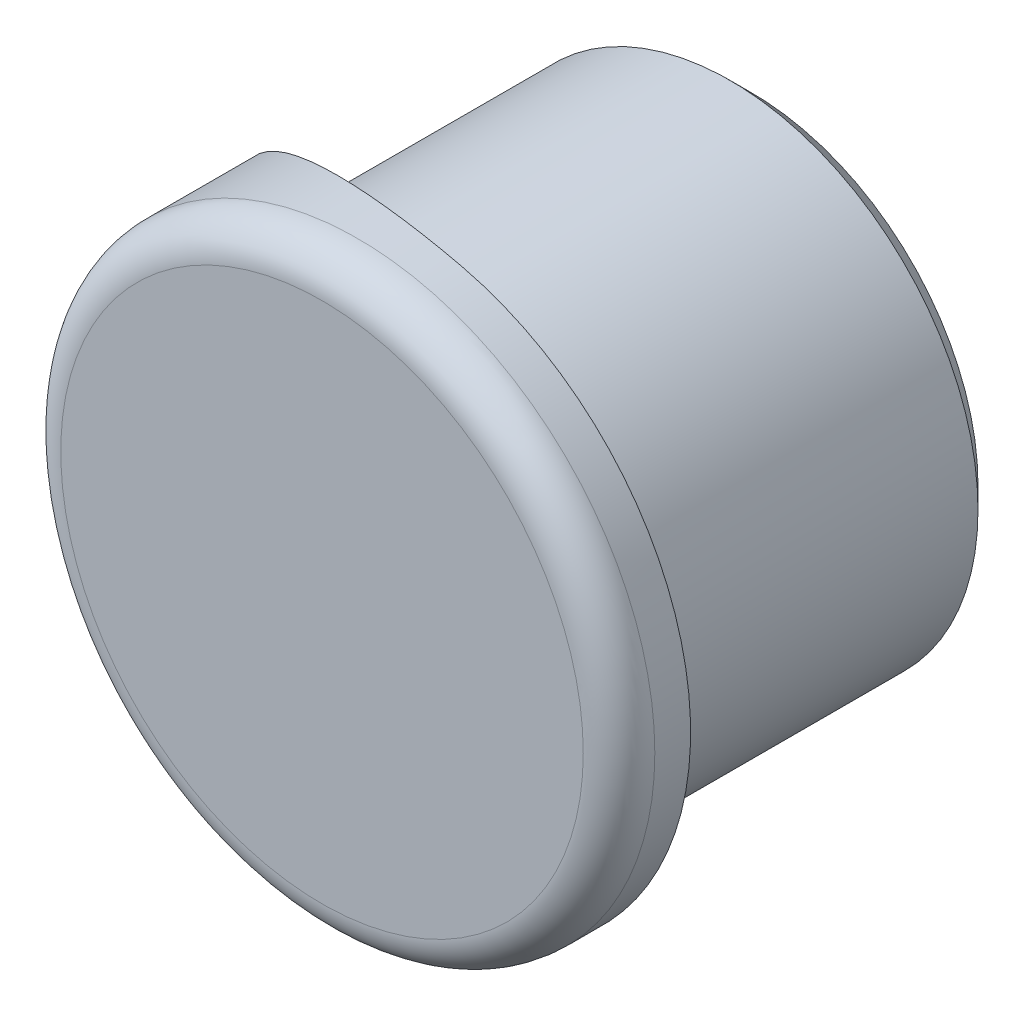
ISO-10303-21;
HEADER;
FILE_DESCRIPTION(('STEP AP214'),'2;1');
FILE_NAME('part.step','',(''),(''),'','','');
FILE_SCHEMA(('AUTOMOTIVE_DESIGN { 1 0 10303 214 1 1 1 1 }'));
ENDSEC;
DATA;
#1=APPLICATION_CONTEXT('core data for automotive mechanical design processes');
#2=APPLICATION_PROTOCOL_DEFINITION('international standard','automotive_design',2000,#1);
#3=PRODUCT_CONTEXT('',#1,'mechanical');
#4=PRODUCT('Part','Part','',(#3));
#5=PRODUCT_RELATED_PRODUCT_CATEGORY('part','',(#4));
#6=PRODUCT_DEFINITION_FORMATION('','',#4);
#7=PRODUCT_DEFINITION_CONTEXT('part definition',#1,'design');
#8=PRODUCT_DEFINITION('design','',#6,#7);
#9=PRODUCT_DEFINITION_SHAPE('','',#8);
#10=(LENGTH_UNIT() NAMED_UNIT(*) SI_UNIT(.MILLI.,.METRE.));
#11=(NAMED_UNIT(*) PLANE_ANGLE_UNIT() SI_UNIT($,.RADIAN.));
#12=(NAMED_UNIT(*) SI_UNIT($,.STERADIAN.) SOLID_ANGLE_UNIT());
#13=UNCERTAINTY_MEASURE_WITH_UNIT(LENGTH_MEASURE(1.E-05),#10,'distance_accuracy_value','');
#14=(GEOMETRIC_REPRESENTATION_CONTEXT(3) GLOBAL_UNCERTAINTY_ASSIGNED_CONTEXT((#13)) GLOBAL_UNIT_ASSIGNED_CONTEXT((#10,
#11,#12)) REPRESENTATION_CONTEXT('',''));
#15=CARTESIAN_POINT('',(0.,0.,0.));
#16=DIRECTION('',(0.,0.,1.));
#17=DIRECTION('',(1.,0.,0.));
#18=AXIS2_PLACEMENT_3D('',#15,#16,#17);
#19=CARTESIAN_POINT('',(-38.,67.,-5.));
#20=DIRECTION('',(0.,0.,1.));
#21=DIRECTION('',(1.,0.,0.));
#22=AXIS2_PLACEMENT_3D('',#19,#20,#21);
#23=CYLINDRICAL_SURFACE('',#22,3.46500000000001);
#24=DIRECTION('',(0.,0.,-1.));
#25=VECTOR('',#24,1.);
#26=CARTESIAN_POINT('',(-39.292284798332,63.785,1.001));
#27=LINE('',#26,#25);
#28=CARTESIAN_POINT('',(-39.292284798332,63.785,-0.325062518872272));
#29=VERTEX_POINT('',#28);
#30=CARTESIAN_POINT('',(-39.292284798332,63.785,-4.69999999999999));
#31=VERTEX_POINT('',#30);
#32=EDGE_CURVE('E63',#29,#31,#27,.T.);
#33=ORIENTED_EDGE('',*,*,#32,.F.);
#34=CARTESIAN_POINT('',(-34.535,67.,-0.400657923214667));
#35=CARTESIAN_POINT('',(-34.5350011192577,67.0948957281984,-0.400656985389254));
#36=CARTESIAN_POINT('',(-34.5389055021327,67.1898219317335,-0.399368852872305));
#37=CARTESIAN_POINT('',(-34.5544772525292,67.3789822970893,-0.394274555914238));
#38=CARTESIAN_POINT('',(-34.5661491313663,67.4732160245484,-0.390466928172532));
#39=CARTESIAN_POINT('',(-34.6127558877772,67.7541885332388,-0.375441268165278));
#40=CARTESIAN_POINT('',(-34.6592816111299,67.9389586494806,-0.360620993873424));
#41=CARTESIAN_POINT('',(-34.7813833588734,68.2971146514612,-0.323725001024826));
#42=CARTESIAN_POINT('',(-34.8568782801617,68.470530751622,-0.301669563058351));
#43=CARTESIAN_POINT('',(-35.0346734192286,68.8023516732511,-0.253571784396536));
#44=CARTESIAN_POINT('',(-35.1369668349063,68.9607602901056,-0.227530456112169));
#45=CARTESIAN_POINT('',(-35.3695894581378,69.2638124229693,-0.174332423293026));
#46=CARTESIAN_POINT('',(-35.5007291471459,69.4078329346568,-0.147167177437789));
#47=CARTESIAN_POINT('',(-35.7857093632476,69.6722495530427,-0.0968249070936301));
#48=CARTESIAN_POINT('',(-35.9395523068001,69.792643141788,-0.0736483077125131));
#49=CARTESIAN_POINT('',(-36.2666303311044,70.0066542459041,-0.0352792019264993));
#50=CARTESIAN_POINT('',(-36.4399334825967,70.1001734247758,-0.0201158513601304));
#51=CARTESIAN_POINT('',(-36.8003942582355,70.2566425288117,-0.00140975183757399));
#52=CARTESIAN_POINT('',(-36.9875447090844,70.3196081555732,0.00213897132229998));
#53=CARTESIAN_POINT('',(-37.3585226743484,70.4101417603151,-0.0045170584851117));
#54=CARTESIAN_POINT('',(-37.5419178704721,70.4395440495656,-0.0139393400777888));
#55=CARTESIAN_POINT('',(-37.9098962281323,70.4687402686873,-0.0458414078334991));
#56=CARTESIAN_POINT('',(-38.094479209676,70.4685385836859,-0.068319259631799));
#57=CARTESIAN_POINT('',(-38.4541801556865,70.4397099509942,-0.124838159056097));
#58=CARTESIAN_POINT('',(-38.6294183252234,70.411882328781,-0.158536344344614));
#59=CARTESIAN_POINT('',(-38.9715232413143,70.3306606715974,-0.235937337453948));
#60=CARTESIAN_POINT('',(-39.1383881713702,70.2772611152933,-0.279642304813141));
#61=CARTESIAN_POINT('',(-39.4696837733798,70.1432500413001,-0.377411480404669));
#62=CARTESIAN_POINT('',(-39.6334122717408,70.0612402007051,-0.431929416844581));
#63=CARTESIAN_POINT('',(-39.9447447011074,69.8735464599806,-0.546079809336016));
#64=CARTESIAN_POINT('',(-40.092340152915,69.7678501989191,-0.605714925761603));
#65=CARTESIAN_POINT('',(-40.382724685148,69.5235598642113,-0.732246807786706));
#66=CARTESIAN_POINT('',(-40.5235882937771,69.3827437618093,-0.799277584037218));
#67=CARTESIAN_POINT('',(-40.7800987392563,69.0777274904943,-0.929290394936549));
#68=CARTESIAN_POINT('',(-40.8957282896773,68.9135114180864,-0.992269633406572));
#69=CARTESIAN_POINT('',(-41.0484614992409,68.6503627988322,-1.07932975913158));
#70=CARTESIAN_POINT('',(-41.0962979423923,68.5588207582527,-1.10736117138529));
#71=CARTESIAN_POINT('',(-41.1839240673632,68.3709764230694,-1.159749309023));
#72=CARTESIAN_POINT('',(-41.2237181048052,68.2746767404787,-1.18410802165));
#73=CARTESIAN_POINT('',(-41.294675136332,68.0780768734887,-1.22822655587355));
#74=CARTESIAN_POINT('',(-41.3258496853295,67.9777822530421,-1.24799252856462));
#75=CARTESIAN_POINT('',(-41.3791081012437,67.7739143771681,-1.28213352888147));
#76=CARTESIAN_POINT('',(-41.4011940970647,67.6703418956758,-1.29650981891721));
#77=CARTESIAN_POINT('',(-41.4334461318672,67.4754358475762,-1.31763605886592));
#78=CARTESIAN_POINT('',(-41.4448372613958,67.3843878309291,-1.32516512785783));
#79=CARTESIAN_POINT('',(-41.4603592015494,67.2014123130447,-1.33544570046317));
#80=CARTESIAN_POINT('',(-41.4644909869457,67.109484931554,-1.33819784551255));
#81=CARTESIAN_POINT('',(-41.4654201832672,66.9256031903779,-1.33881547526933));
#82=CARTESIAN_POINT('',(-41.4622200474372,66.8336488500067,-1.33668259449584));
#83=CARTESIAN_POINT('',(-41.4485574571683,66.65054665138,-1.32762645527127));
#84=CARTESIAN_POINT('',(-41.4380952964178,66.5593987606612,-1.3207033905433));
#85=CARTESIAN_POINT('',(-41.3991567922284,66.3084016400528,-1.29514526789084));
#86=CARTESIAN_POINT('',(-41.3630005351098,66.150167119285,-1.27159007893166));
#87=CARTESIAN_POINT('',(-41.2698850415623,65.8424143958316,-1.2126047075434));
#88=CARTESIAN_POINT('',(-41.2129195982387,65.6928988092471,-1.17717098228377));
#89=CARTESIAN_POINT('',(-41.0747103407353,65.3932075143471,-1.09436969996753));
#90=CARTESIAN_POINT('',(-40.9918608605046,65.2439796294623,-1.04626269629798));
#91=CARTESIAN_POINT('',(-40.8064224035896,64.9606532947735,-0.943967934044831));
#92=CARTESIAN_POINT('',(-40.7038219304809,64.826563728973,-0.889776641684433));
#93=CARTESIAN_POINT('',(-40.4634534285218,64.5555530744633,-0.77045182146391));
#94=CARTESIAN_POINT('',(-40.3226971434884,64.4214412832022,-0.704928243285893));
#95=CARTESIAN_POINT('',(-40.0201322502592,64.1781205054357,-0.575981722355459));
#96=CARTESIAN_POINT('',(-39.8583127691189,64.0689244612874,-0.512559885895578));
#97=CARTESIAN_POINT('',(-39.5075948292173,63.8733805738751,-0.389312821231469));
#98=CARTESIAN_POINT('',(-39.3177191923377,63.7885385095194,-0.329852799274537));
#99=CARTESIAN_POINT('',(-38.9227606879262,63.6536302915031,-0.223234961128988));
#100=CARTESIAN_POINT('',(-38.7176891958916,63.6035384094773,-0.176068059539049));
#101=CARTESIAN_POINT('',(-38.3159220961729,63.5439552757278,-0.100786488654761));
#102=CARTESIAN_POINT('',(-38.1199008637462,63.5314944461973,-0.0714346881586112));
#103=CARTESIAN_POINT('',(-37.7269724878194,63.5401975142087,-0.027536377717417));
#104=CARTESIAN_POINT('',(-37.5300658651042,63.5613437113143,-0.0129820807159925));
#105=CARTESIAN_POINT('',(-37.1583336236302,63.6338886683361,0.00103459603555801));
#106=CARTESIAN_POINT('',(-36.983027340551,63.6826450020609,0.00164400037690785));
#107=CARTESIAN_POINT('',(-36.6424697354413,63.8068530308265,-0.00781965603974612));
#108=CARTESIAN_POINT('',(-36.477218858977,63.8823059078124,-0.0178931898065255));
#109=CARTESIAN_POINT('',(-36.1598769632398,64.0583395311885,-0.0463988664987246));
#110=CARTESIAN_POINT('',(-36.0078962089916,64.1591079696991,-0.064894322054996));
#111=CARTESIAN_POINT('',(-35.7220175286328,64.382754681577,-0.107155832494376));
#112=CARTESIAN_POINT('',(-35.5881237451018,64.5056380050839,-0.130923091531641));
#113=CARTESIAN_POINT('',(-35.3339116935948,64.7785062773143,-0.181808882945439));
#114=CARTESIAN_POINT('',(-35.2148852828911,64.9296729836955,-0.209042849933061));
#115=CARTESIAN_POINT('',(-35.0032114322688,65.2500528969504,-0.261538577492637));
#116=CARTESIAN_POINT('',(-34.9105817823354,65.4192781692397,-0.286798999719347));
#117=CARTESIAN_POINT('',(-34.7926199931933,65.6852096901427,-0.320583376809268));
#118=CARTESIAN_POINT('',(-34.7565066355997,65.7770021463424,-0.331258845429686));
#119=CARTESIAN_POINT('',(-34.6921888233801,65.9635048078427,-0.350662151748602));
#120=CARTESIAN_POINT('',(-34.6639810801291,66.0582137816615,-0.359390798988086));
#121=CARTESIAN_POINT('',(-34.6157823568693,66.2496513067681,-0.374514950191058));
#122=CARTESIAN_POINT('',(-34.5957734288891,66.3463749543007,-0.380915546983146));
#123=CARTESIAN_POINT('',(-34.5640831796046,66.5412679108087,-0.391133445935712));
#124=CARTESIAN_POINT('',(-34.5523964880248,66.6394362457133,-0.394952413920624));
#125=CARTESIAN_POINT('',(-34.5416182925394,66.7815181372765,-0.398483270080353));
#126=CARTESIAN_POINT('',(-34.5391372354021,66.8251715777705,-0.399297907541584));
#127=CARTESIAN_POINT('',(-34.5358278257751,66.9125478547272,-0.400385451984138));
#128=CARTESIAN_POINT('',(-34.5349994842301,66.9562706916475,-0.400658355378025));
#129=CARTESIAN_POINT('',(-34.535,67.,-0.400657923214667));
#130=B_SPLINE_CURVE_WITH_KNOTS('',3,(#34,#35,#36,#37,#38,#39,#40,#41,#42,#43,#44,#45,#46,#47,
#48,#49,#50,#51,#52,#53,#54,#55,#56,#57,#58,#59,#60,#61,#62,#63,#64,#65,#66,#67,#68,#69,#70,#71,
#72,#73,#74,#75,#76,#77,#78,#79,#80,#81,#82,#83,#84,#85,#86,#87,#88,#89,#90,#91,#92,#93,#94,#95,
#96,#97,#98,#99,#100,#101,#102,#103,#104,#105,#106,#107,#108,#109,#110,#111,#112,#113,#114,#115,
#116,#117,#118,#119,#120,#121,#122,#123,#124,#125,#126,#127,#128,#129),.UNSPECIFIED.,.T.,.F.,(4,
2,2,2,2,2,2,2,2,2,2,2,2,2,2,2,2,2,2,2,2,2,2,2,2,2,2,2,2,2,2,2,2,2,2,2,2,2,2,2,2,2,2,2,2,2,2,4),
(0.,0.284640611948893,0.569446685927191,1.13976936155237,1.70850685739108,2.27710013363597,
2.86436883992426,3.45170009828666,4.04115387217319,4.63030440165197,5.18542957441174,
5.74047251861201,6.27991062964134,6.81946526535747,7.39030547681752,7.9614442820149,
8.58917713224544,9.21733866627191,9.53802211699978,9.85853142314634,10.1786089618996,
10.4986114828974,10.7744128568663,11.0501771939033,11.3258492742678,11.6015102066413,
12.0912349943867,12.5811059750482,13.1110767275559,13.6413568970471,14.2541948851555,
14.8673504877714,15.5127910043381,16.1577531377056,16.7502830614329,17.342501009842,
17.8858142321222,18.4291515117029,18.9766425929876,19.5242588579601,20.1046453707213,
20.6854221124281,20.9827604175396,21.2799748498674,21.5765351306743,21.8729038695673,
22.0040694646897,22.1352359284058),.UNSPECIFIED.);
#131=CARTESIAN_POINT('',(-37.035,70.3279122584588,0.));
#132=VERTEX_POINT('',#131);
#133=EDGE_CURVE('E102',#132,#29,#130,.T.);
#134=ORIENTED_EDGE('',*,*,#133,.F.);
#135=CARTESIAN_POINT('',(-38.,67.,0.));
#136=DIRECTION('',(0.,0.,1.));
#137=DIRECTION('',(1.,0.,0.));
#138=AXIS2_PLACEMENT_3D('',#135,#136,#137);
#139=CIRCLE('',#138,3.46500000000001);
#140=CARTESIAN_POINT('',(-37.035,63.6720877415413,0.));
#141=VERTEX_POINT('',#140);
#142=EDGE_CURVE('E106',#141,#132,#139,.T.);
#143=ORIENTED_EDGE('',*,*,#142,.F.);
#144=CARTESIAN_POINT('',(-39.292284798332,63.785,-0.32506251887227));
#145=CARTESIAN_POINT('',(-39.2088110317047,63.7514391783668,-0.30050079710655));
#146=CARTESIAN_POINT('',(-39.1237478930821,63.7210322117049,-0.276973220778825));
#147=CARTESIAN_POINT('',(-38.9509018796859,63.6668026124838,-0.232294706070464));
#148=CARTESIAN_POINT('',(-38.8631178814633,63.6429827411372,-0.211144766557959));
#149=CARTESIAN_POINT('',(-38.6852133700739,63.6021989514927,-0.171518336201442));
#150=CARTESIAN_POINT('',(-38.5950892443047,63.5852463979842,-0.153046309230043));
#151=CARTESIAN_POINT('',(-38.4132452753811,63.5585037890876,-0.11907429613798));
#152=CARTESIAN_POINT('',(-38.3215257137865,63.5487124827642,-0.103573791297468));
#153=CARTESIAN_POINT('',(-38.1368344898777,63.5364624289042,-0.0756886904899066));
#154=CARTESIAN_POINT('',(-38.0438598445084,63.5340263227621,-0.0633138230279588));
#155=CARTESIAN_POINT('',(-37.8576386239975,63.5366737523988,-0.0418564087764505));
#156=CARTESIAN_POINT('',(-37.7643920582034,63.5417570326622,-0.0327737501277287));
#157=CARTESIAN_POINT('',(-37.5785571445745,63.5594616029903,-0.0179441217451942));
#158=CARTESIAN_POINT('',(-37.485967806473,63.5720664811043,-0.0121899430232769));
#159=CARTESIAN_POINT('',(-37.302009036846,63.6047451241238,-0.00392726040343618));
#160=CARTESIAN_POINT('',(-37.2106390583764,63.6248154152018,-0.00141724934708018));
#161=CARTESIAN_POINT('',(-37.0500879109878,63.6669606606188,0.000293278203638717));
#162=CARTESIAN_POINT('',(-36.980525475394,63.6875769168664,0.000109696748403054));
#163=CARTESIAN_POINT('',(-36.842923192907,63.7330975636126,-0.00200942063283656));
#164=CARTESIAN_POINT('',(-36.7748818739291,63.7579975856741,-0.00394318026405082));
#165=CARTESIAN_POINT('',(-36.707715201668,63.785,-0.00669751224308465));
#166=B_SPLINE_CURVE_WITH_KNOTS('',3,(#144,#145,#146,#147,#148,#149,#150,#151,#152,#153,#154,
#155,#156,#157,#158,#159,#160,#161,#162,#163,#164,#165),.UNSPECIFIED.,.F.,.F.,(4,2,2,2,2,2,2,2,
2,2,4),(0.,0.279731771267792,0.559580624812562,0.839890729254229,1.12015185708577,
1.40127483312486,1.68238825657162,1.96289052855738,2.24326243937007,2.46076460981109,
2.67804627969648),.UNSPECIFIED.);
#167=CARTESIAN_POINT('',(-36.707715201668,63.785,-0.00669751224309338));
#168=VERTEX_POINT('',#167);
#169=EDGE_CURVE('E95',#141,#168,#166,.T.);
#170=ORIENTED_EDGE('',*,*,#169,.T.);
#171=DIRECTION('',(0.,0.,-1.));
#172=VECTOR('',#171,1.);
#173=CARTESIAN_POINT('',(-36.707715201668,63.785,1.001));
#174=LINE('',#173,#172);
#175=CARTESIAN_POINT('',(-36.707715201668,63.785,-4.69999999999999));
#176=VERTEX_POINT('',#175);
#177=EDGE_CURVE('E87',#168,#176,#174,.T.);
#178=ORIENTED_EDGE('',*,*,#177,.T.);
#179=CARTESIAN_POINT('',(-38.,67.,-4.69999999999999));
#180=DIRECTION('',(0.,0.,1.));
#181=DIRECTION('',(1.,0.,0.));
#182=AXIS2_PLACEMENT_3D('',#179,#180,#181);
#183=CIRCLE('',#182,3.46500000000001);
#184=EDGE_CURVE('E151',#176,#31,#183,.T.);
#185=ORIENTED_EDGE('',*,*,#184,.T.);
#186=EDGE_LOOP('',(#33,#134,#143,#170,#178,#185));
#187=FACE_BOUND('',#186,.T.);
#188=ADVANCED_FACE('F42',(#187),#23,.T.);
#189=CARTESIAN_POINT('',(-38.,67.,-5.));
#190=DIRECTION('',(0.,0.,1.));
#191=DIRECTION('',(1.,0.,0.));
#192=AXIS2_PLACEMENT_3D('',#189,#190,#191);
#193=PLANE('',#192);
#194=CARTESIAN_POINT('',(-38.,67.,-5.));
#195=DIRECTION('',(0.,0.,1.));
#196=DIRECTION('',(1.,0.,0.));
#197=AXIS2_PLACEMENT_3D('',#194,#195,#196);
#198=CIRCLE('',#197,3.165);
#199=CARTESIAN_POINT('',(-34.835,67.,-5.));
#200=VERTEX_POINT('',#199);
#201=EDGE_CURVE('E57',#200,#200,#198,.F.);
#202=ORIENTED_EDGE('',*,*,#201,.T.);
#203=EDGE_LOOP('',(#202));
#204=FACE_BOUND('',#203,.T.);
#205=ADVANCED_FACE('F155',(#204),#193,.F.);
#206=CARTESIAN_POINT('',(-38.,67.,1.));
#207=DIRECTION('',(0.,0.,-1.));
#208=DIRECTION('',(-1.,0.,0.));
#209=AXIS2_PLACEMENT_3D('',#206,#207,#208);
#210=CYLINDRICAL_SURFACE('',#209,4.15);
#211=CARTESIAN_POINT('',(-37.035,71.0362451610377,0.));
#212=CARTESIAN_POINT('',(-37.1389135149355,71.0611079817524,1.89169779381795E-05));
#213=CARTESIAN_POINT('',(-37.2437955322097,71.081922915731,-0.00202389874618023));
#214=CARTESIAN_POINT('',(-37.4546683406772,71.1153939456416,-0.010323578353209));
#215=CARTESIAN_POINT('',(-37.5606589188467,71.1280515808569,-0.0165796467388777));
#216=CARTESIAN_POINT('',(-37.7725222945634,71.1451190816508,-0.0333616310134262));
#217=CARTESIAN_POINT('',(-37.8783937723876,71.1495627761947,-0.0438698154999375));
#218=CARTESIAN_POINT('',(-38.089658042955,71.1503757364488,-0.0691103473404647));
#219=CARTESIAN_POINT('',(-38.1950508378342,71.1467450382211,-0.0838426758281747));
#220=CARTESIAN_POINT('',(-38.4045601836983,71.1315679921022,-0.117389394789987));
#221=CARTESIAN_POINT('',(-38.5086773060836,71.1200253307163,-0.136201881363199));
#222=CARTESIAN_POINT('',(-38.7150075392414,71.0892739945365,-0.177680947209888));
#223=CARTESIAN_POINT('',(-38.8172199108204,71.0700624058739,-0.200348989550854));
#224=CARTESIAN_POINT('',(-39.1200758691205,71.0013389960265,-0.273715798384254));
#225=CARTESIAN_POINT('',(-39.3170192516607,70.9407323337533,-0.329790460113771));
#226=CARTESIAN_POINT('',(-39.7051398167684,70.7895099322629,-0.455867304034078));
#227=CARTESIAN_POINT('',(-39.8956665510677,70.6976747389526,-0.526379694514081));
#228=CARTESIAN_POINT('',(-40.2584168970998,70.4879769884797,-0.675514728598037));
#229=CARTESIAN_POINT('',(-40.430626987067,70.37009539813,-0.754143280514679));
#230=CARTESIAN_POINT('',(-40.7763646952639,70.0934969622362,-0.925803074440837));
#231=CARTESIAN_POINT('',(-40.9469519052243,69.9314198179557,-1.01934872426885));
#232=CARTESIAN_POINT('',(-41.2591187576431,69.579903700734,-1.20370117175869));
#233=CARTESIAN_POINT('',(-41.4006933858657,69.3904600076701,-1.29450749367446));
#234=CARTESIAN_POINT('',(-41.6349101216026,69.0130912477936,-1.45338544851009));
#235=CARTESIAN_POINT('',(-41.7315400700653,68.8282480086606,-1.52287631277185));
#236=CARTESIAN_POINT('',(-41.8971533464349,68.4417729767873,-1.64624764454559));
#237=CARTESIAN_POINT('',(-41.9661818795391,68.2401692937627,-1.70015359635628));
#238=CARTESIAN_POINT('',(-42.064693076734,67.8565339639283,-1.77862164178542));
#239=CARTESIAN_POINT('',(-42.0986557972807,67.6763332182839,-1.80644310750016));
#240=CARTESIAN_POINT('',(-42.1423965210148,67.3111164231759,-1.84245594291728));
#241=CARTESIAN_POINT('',(-42.1521934199031,67.1261042503263,-1.85066264960499));
#242=CARTESIAN_POINT('',(-42.1469771588566,66.7565597474659,-1.8463267732705));
#243=CARTESIAN_POINT('',(-42.1319462428684,66.572027855481,-1.83376934039776));
#244=CARTESIAN_POINT('',(-42.0780251727898,66.2088046245632,-1.78960027745198));
#245=CARTESIAN_POINT('',(-42.0391165958171,66.0301179077298,-1.75797393503358));
#246=CARTESIAN_POINT('',(-41.9389745922965,65.6807631636107,-1.67899584016737));
#247=CARTESIAN_POINT('',(-41.8775086433209,65.5102003494238,-1.63148077629907));
#248=CARTESIAN_POINT('',(-41.734633723052,65.1814331915484,-1.52532962372409));
#249=CARTESIAN_POINT('',(-41.6532178052639,65.0232331778952,-1.46668966298444));
#250=CARTESIAN_POINT('',(-41.4540060687908,64.6897346547747,-1.32993726480183));
#251=CARTESIAN_POINT('',(-41.3321811201858,64.5174714539867,-1.25028721984197));
#252=CARTESIAN_POINT('',(-41.0649358255179,64.1941549796061,-1.087387809847));
#253=CARTESIAN_POINT('',(-40.9194903436855,64.0431246239115,-1.00413468059121));
#254=CARTESIAN_POINT('',(-40.579381173062,63.7396640988152,-0.825023159385072));
#255=CARTESIAN_POINT('',(-40.3805582161435,63.5916034101299,-0.729504987108265));
#256=CARTESIAN_POINT('',(-40.0625965436332,63.3967106548949,-0.594121255174185));
#257=CARTESIAN_POINT('',(-39.9532573852021,63.3362542878907,-0.550287504788075));
#258=CARTESIAN_POINT('',(-39.7285038670213,63.2250204110157,-0.466116942361644));
#259=CARTESIAN_POINT('',(-39.6130929292975,63.1742375222387,-0.425778193780065));
#260=CARTESIAN_POINT('',(-39.3801271859431,63.0842739032036,-0.350493124651787));
#261=CARTESIAN_POINT('',(-39.2627191585208,63.0448119562349,-0.315428816153777));
#262=CARTESIAN_POINT('',(-39.0236573359609,62.9763107710146,-0.250123695618747));
#263=CARTESIAN_POINT('',(-38.902005918258,62.9472657962053,-0.219880233887203));
#264=CARTESIAN_POINT('',(-38.6555274650118,62.9001830814429,-0.164835236264505));
#265=CARTESIAN_POINT('',(-38.5307044580355,62.8821320401754,-0.140027147608859));
#266=CARTESIAN_POINT('',(-38.2789849889568,62.8574561668202,-0.0962771651299195));
#267=CARTESIAN_POINT('',(-38.1520893555799,62.8508268755138,-0.0773329843217852));
#268=CARTESIAN_POINT('',(-37.8592468401507,62.8490950314318,-0.0408330989229406));
#269=CARTESIAN_POINT('',(-37.6929762466876,62.8580350076893,-0.0253889437377299));
#270=CARTESIAN_POINT('',(-37.4448650401561,62.8864497947605,-0.0100731221140737));
#271=CARTESIAN_POINT('',(-37.3623177421114,62.8984363316898,-0.00627635143574174));
#272=CARTESIAN_POINT('',(-37.1979935560456,62.9273789114569,-0.00123807465226638));
#273=CARTESIAN_POINT('',(-37.1162169140965,62.9443364895338,2.64109797235787E-06));
#274=CARTESIAN_POINT('',(-37.035,62.9637548389623,0.));
#275=B_SPLINE_CURVE_WITH_KNOTS('',3,(#211,#212,#213,#214,#215,#216,#217,#218,#219,#220,#221,
#222,#223,#224,#225,#226,#227,#228,#229,#230,#231,#232,#233,#234,#235,#236,#237,#238,#239,#240,
#241,#242,#243,#244,#245,#246,#247,#248,#249,#250,#251,#252,#253,#254,#255,#256,#257,#258,#259,
#260,#261,#262,#263,#264,#265,#266,#267,#268,#269,#270,#271,#272,#273,#274),.UNSPECIFIED.,.F.,
.F.,(4,2,2,2,2,2,2,2,2,2,2,2,2,2,2,2,2,2,2,2,2,2,2,2,2,2,2,2,2,2,2,4),(0.,0.320439850221581,
0.64081921568246,0.959876139188177,1.27893163771129,1.59783857627413,1.91686680152822,
2.55467941541736,3.22098010275811,3.887769303564,4.64427560535393,5.40091254383847,
6.05796374542504,6.71393438654321,7.26790881305811,7.82144993926243,8.37538711167531,
8.92975221428211,9.49000005359216,10.0504432467285,10.7245021426198,11.3992830953165,
12.1920082700345,12.5887974923493,12.9853654331028,13.37100245008,13.7564267720334,
14.1413838465404,14.5261905940753,15.0261382377603,15.2764751104126,15.5268893778403),.UNSPECIFIED.);
#276=CARTESIAN_POINT('',(-37.035,71.0362451610377,0.));
#277=VERTEX_POINT('',#276);
#278=CARTESIAN_POINT('',(-37.035,62.9637548389623,0.));
#279=VERTEX_POINT('',#278);
#280=EDGE_CURVE('E70',#277,#279,#275,.T.);
#281=ORIENTED_EDGE('',*,*,#280,.T.);
#282=CARTESIAN_POINT('',(-38.,67.,0.));
#283=DIRECTION('',(0.,0.,1.));
#284=DIRECTION('',(1.,0.,0.));
#285=AXIS2_PLACEMENT_3D('',#282,#283,#284);
#286=CIRCLE('',#285,4.15);
#287=EDGE_CURVE('E137',#279,#277,#286,.T.);
#288=ORIENTED_EDGE('',*,*,#287,.T.);
#289=EDGE_LOOP('',(#281,#288));
#290=FACE_BOUND('',#289,.T.);
#291=CARTESIAN_POINT('',(-38.,67.,0.5));
#292=DIRECTION('',(0.,0.,1.));
#293=DIRECTION('',(1.,0.,0.));
#294=AXIS2_PLACEMENT_3D('',#291,#292,#293);
#295=CIRCLE('',#294,4.15);
#296=CARTESIAN_POINT('',(-33.85,67.,0.5));
#297=VERTEX_POINT('',#296);
#298=EDGE_CURVE('E144',#297,#297,#295,.F.);
#299=ORIENTED_EDGE('',*,*,#298,.T.);
#300=EDGE_LOOP('',(#299));
#301=FACE_BOUND('',#300,.T.);
#302=ADVANCED_FACE('F167',(#290,#301),#210,.T.);
#303=CARTESIAN_POINT('',(-38.,67.,1.));
#304=DIRECTION('',(0.,0.,1.));
#305=DIRECTION('',(1.,0.,0.));
#306=AXIS2_PLACEMENT_3D('',#303,#304,#305);
#307=PLANE('',#306);
#308=CARTESIAN_POINT('',(-38.,67.,1.));
#309=DIRECTION('',(0.,0.,1.));
#310=DIRECTION('',(1.,0.,0.));
#311=AXIS2_PLACEMENT_3D('',#308,#309,#310);
#312=CIRCLE('',#311,3.65);
#313=CARTESIAN_POINT('',(-34.35,67.,1.));
#314=VERTEX_POINT('',#313);
#315=EDGE_CURVE('E139',#314,#314,#312,.T.);
#316=ORIENTED_EDGE('',*,*,#315,.T.);
#317=EDGE_LOOP('',(#316));
#318=FACE_BOUND('',#317,.T.);
#319=ADVANCED_FACE('F122',(#318),#307,.T.);
#320=CARTESIAN_POINT('',(-38.,67.,0.));
#321=DIRECTION('',(0.,0.,1.));
#322=DIRECTION('',(1.,0.,0.));
#323=AXIS2_PLACEMENT_3D('',#320,#321,#322);
#324=PLANE('',#323);
#325=ORIENTED_EDGE('',*,*,#287,.F.);
#326=DIRECTION('',(0.,-1.,0.));
#327=VECTOR('',#326,1.);
#328=CARTESIAN_POINT('',(-37.035,73.15,0.));
#329=LINE('',#328,#327);
#330=EDGE_CURVE('E150',#279,#141,#329,.F.);
#331=ORIENTED_EDGE('',*,*,#330,.T.);
#332=ORIENTED_EDGE('',*,*,#142,.T.);
#333=EDGE_CURVE('E147',#132,#277,#329,.F.);
#334=ORIENTED_EDGE('',*,*,#333,.T.);
#335=EDGE_LOOP('',(#325,#331,#332,#334));
#336=FACE_BOUND('',#335,.T.);
#337=ADVANCED_FACE('F172',(#336),#324,.F.);
#338=CARTESIAN_POINT('',(-38.,67.,0.5));
#339=DIRECTION('',(0.,0.,1.));
#340=DIRECTION('',(1.,0.,0.));
#341=AXIS2_PLACEMENT_3D('',#338,#339,#340);
#342=TOROIDAL_SURFACE('',#341,3.65,0.5);
#343=ORIENTED_EDGE('',*,*,#298,.F.);
#344=EDGE_LOOP('',(#343));
#345=FACE_BOUND('',#344,.T.);
#346=ORIENTED_EDGE('',*,*,#315,.F.);
#347=EDGE_LOOP('',(#346));
#348=FACE_BOUND('',#347,.T.);
#349=ADVANCED_FACE('F120',(#345,#348),#342,.T.);
#350=CARTESIAN_POINT('',(-37.035,73.15,-8.));
#351=DIRECTION('',(0.,-1.,0.));
#352=DIRECTION('',(0.,0.,-1.));
#353=AXIS2_PLACEMENT_3D('',#350,#351,#352);
#354=CYLINDRICAL_SURFACE('',#353,8.);
#355=ORIENTED_EDGE('',*,*,#280,.F.);
#356=ORIENTED_EDGE('',*,*,#333,.F.);
#357=ORIENTED_EDGE('',*,*,#133,.T.);
#358=CARTESIAN_POINT('',(-37.035,63.785,-8.));
#359=DIRECTION('',(0.,1.,0.));
#360=DIRECTION('',(0.,0.,1.));
#361=AXIS2_PLACEMENT_3D('',#358,#359,#360);
#362=CIRCLE('',#361,8.);
#363=EDGE_CURVE('E90',#168,#29,#362,.F.);
#364=ORIENTED_EDGE('',*,*,#363,.F.);
#365=ORIENTED_EDGE('',*,*,#169,.F.);
#366=ORIENTED_EDGE('',*,*,#330,.F.);
#367=EDGE_LOOP('',(#355,#356,#357,#364,#365,#366));
#368=FACE_BOUND('',#367,.T.);
#369=ADVANCED_FACE('F99',(#368),#354,.F.);
#370=CARTESIAN_POINT('',(-38.,67.,-4.69999999999999));
#371=DIRECTION('',(0.,0.,1.));
#372=DIRECTION('',(1.,0.,0.));
#373=AXIS2_PLACEMENT_3D('',#370,#371,#372);
#374=CONICAL_SURFACE('',#373,3.46500000000001,0.785398163397445);
#375=CARTESIAN_POINT('',(-41.8944071645835,63.785,-3.11498691451601));
#376=CARTESIAN_POINT('',(-41.7996975741854,63.785,-3.18800712520102));
#377=CARTESIAN_POINT('',(-41.7044764291631,63.785,-3.2603743963933));
#378=CARTESIAN_POINT('',(-41.5127989639876,63.785,-3.40350104047271));
#379=CARTESIAN_POINT('',(-41.4163423526672,63.785,-3.47426002300626));
#380=CARTESIAN_POINT('',(-41.2212513821024,63.785,-3.61438994350583));
#381=CARTESIAN_POINT('',(-41.1226057835312,63.785,-3.68374528591403));
#382=CARTESIAN_POINT('',(-40.923659046731,63.785,-3.82003137696832));
#383=CARTESIAN_POINT('',(-40.8233580232444,63.785,-3.88696229263994));
#384=CARTESIAN_POINT('',(-40.6139190585019,63.785,-4.02229820688271));
#385=CARTESIAN_POINT('',(-40.5046445881599,63.785,-4.09049302000148));
#386=CARTESIAN_POINT('',(-40.2834846053964,63.785,-4.22258230949406));
#387=CARTESIAN_POINT('',(-40.1715986426871,63.785,-4.28647603676327));
#388=CARTESIAN_POINT('',(-39.945175675712,63.785,-4.40855633323258));
#389=CARTESIAN_POINT('',(-39.8306479088896,63.785,-4.46675989160018));
#390=CARTESIAN_POINT('',(-39.598291506959,63.785,-4.57609214015871));
#391=CARTESIAN_POINT('',(-39.4804644992051,63.785,-4.62722424692755));
#392=CARTESIAN_POINT('',(-39.245947448761,63.785,-4.71863639530164));
#393=CARTESIAN_POINT('',(-39.1293947159692,63.785,-4.75926395844252));
#394=CARTESIAN_POINT('',(-38.8931243666439,63.785,-4.83015124317018));
#395=CARTESIAN_POINT('',(-38.7734069080381,63.785,-4.86041148106466));
#396=CARTESIAN_POINT('',(-38.5341675363277,63.785,-4.90798483568899));
#397=CARTESIAN_POINT('',(-38.4147015230355,63.785,-4.92557325643952));
#398=CARTESIAN_POINT('',(-38.1745518675374,63.785,-4.94748322896245));
#399=CARTESIAN_POINT('',(-38.053868471284,63.785,-4.9518074087562));
#400=CARTESIAN_POINT('',(-37.8122689275567,63.785,-4.94679935990068));
#401=CARTESIAN_POINT('',(-37.6913540369503,63.785,-4.93740788423934));
#402=CARTESIAN_POINT('',(-37.451245303929,63.785,-4.90567945433441));
#403=CARTESIAN_POINT('',(-37.3320519287993,63.785,-4.88333905051202));
#404=CARTESIAN_POINT('',(-37.093698864316,63.785,-4.82675515047934));
#405=CARTESIAN_POINT('',(-36.9746022457072,63.785,-4.79225119909017));
#406=CARTESIAN_POINT('',(-36.7397001935728,63.785,-4.71357754500105));
#407=CARTESIAN_POINT('',(-36.6238948444679,63.785,-4.66940759462192));
#408=CARTESIAN_POINT('',(-36.3969723956492,63.785,-4.57397611275537));
#409=CARTESIAN_POINT('',(-36.2858150073093,63.785,-4.52280913095169));
#410=CARTESIAN_POINT('',(-36.0664046639694,63.785,-4.41454578601841));
#411=CARTESIAN_POINT('',(-35.9581527672186,63.785,-4.35744729840345));
#412=CARTESIAN_POINT('',(-35.7440206288544,63.785,-4.23845847632877));
#413=CARTESIAN_POINT('',(-35.6381461694388,63.785,-4.17655781145159));
#414=CARTESIAN_POINT('',(-35.4286566211432,63.785,-4.04904000787485));
#415=CARTESIAN_POINT('',(-35.3250417705163,63.785,-3.98342247986856));
#416=CARTESIAN_POINT('',(-35.1262051702635,63.785,-3.85343109029289));
#417=CARTESIAN_POINT('',(-35.0308648653829,63.785,-3.78923774652802));
#418=CARTESIAN_POINT('',(-34.8416580781008,63.785,-3.65870871403338));
#419=CARTESIAN_POINT('',(-34.7477916780977,63.785,-3.59237290615879));
#420=CARTESIAN_POINT('',(-34.5619070342787,63.785,-3.4583474204787));
#421=CARTESIAN_POINT('',(-34.4698809903236,63.785,-3.3906685288429));
#422=CARTESIAN_POINT('',(-34.2869452496866,63.785,-3.25385439995551));
#423=CARTESIAN_POINT('',(-34.1960353356449,63.785,-3.18471945361863));
#424=CARTESIAN_POINT('',(-34.1055928354165,63.785,-3.11498691451601));
#425=B_SPLINE_CURVE_WITH_KNOTS('',3,(#375,#376,#377,#378,#379,#380,#381,#382,#383,#384,#385,
#386,#387,#388,#389,#390,#391,#392,#393,#394,#395,#396,#397,#398,#399,#400,#401,#402,#403,#404,
#405,#406,#407,#408,#409,#410,#411,#412,#413,#414,#415,#416,#417,#418,#419,#420,#421,#422,#423,
#424),.UNSPECIFIED.,.F.,.F.,(4,2,2,2,2,2,2,2,2,2,2,2,2,2,2,2,2,2,2,2,2,2,2,2,4),(0.,
0.358777834881145,0.717641839704865,1.07937143251025,1.441076057171,1.82742085957202,
2.21383277708445,2.59905329196724,2.98408703210491,3.35398847279453,3.72387148918215,
4.08545406662083,4.44696499969423,4.81004216450387,5.17321609711511,5.54469302441067,
5.91617947145464,6.28306754130081,6.65008747538057,7.01792008488062,7.38579129291136,
7.73056886353489,8.07536564075206,8.41804972815468,8.76066598605848),.UNSPECIFIED.);
#426=EDGE_CURVE('E11',#31,#176,#425,.T.);
#427=ORIENTED_EDGE('',*,*,#426,.F.);
#428=ORIENTED_EDGE('',*,*,#184,.F.);
#429=EDGE_LOOP('',(#427,#428));
#430=FACE_BOUND('',#429,.T.);
#431=ORIENTED_EDGE('',*,*,#201,.F.);
#432=EDGE_LOOP('',(#431));
#433=FACE_BOUND('',#432,.T.);
#434=ADVANCED_FACE('F45',(#430,#433),#374,.T.);
#435=CARTESIAN_POINT('',(-36.707715201668,63.785,1.001));
#436=DIRECTION('',(0.,1.,0.));
#437=DIRECTION('',(0.,0.,1.));
#438=AXIS2_PLACEMENT_3D('',#435,#436,#437);
#439=PLANE('',#438);
#440=ORIENTED_EDGE('',*,*,#426,.T.);
#441=ORIENTED_EDGE('',*,*,#177,.F.);
#442=ORIENTED_EDGE('',*,*,#363,.T.);
#443=ORIENTED_EDGE('',*,*,#32,.T.);
#444=EDGE_LOOP('',(#440,#441,#442,#443));
#445=FACE_BOUND('',#444,.T.);
#446=ADVANCED_FACE('F89',(#445),#439,.F.);
#447=CLOSED_SHELL('',(#188,#205,#302,#319,#337,#349,#369,#434,#446));
#448=MANIFOLD_SOLID_BREP('B2',#447);
#449=ADVANCED_BREP_SHAPE_REPRESENTATION('',(#18,#448),#14);
#450=SHAPE_DEFINITION_REPRESENTATION(#9,#449);
ENDSEC;
END-ISO-10303-21;
